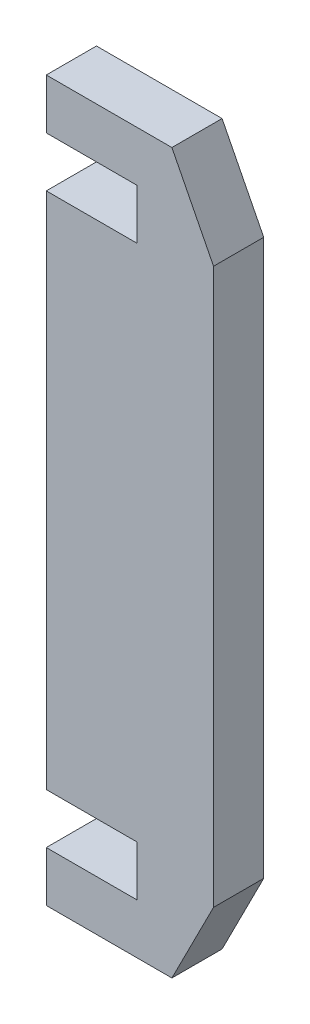
ISO-10303-21;
HEADER;
FILE_DESCRIPTION(('STEP AP214'),'2;1');
FILE_NAME('part.step','',(''),(''),'','','');
FILE_SCHEMA(('AUTOMOTIVE_DESIGN { 1 0 10303 214 1 1 1 1 }'));
ENDSEC;
DATA;
#1=APPLICATION_CONTEXT('core data for automotive mechanical design processes');
#2=APPLICATION_PROTOCOL_DEFINITION('international standard','automotive_design',2000,#1);
#3=PRODUCT_CONTEXT('',#1,'mechanical');
#4=PRODUCT('Part','Part','',(#3));
#5=PRODUCT_RELATED_PRODUCT_CATEGORY('part','',(#4));
#6=PRODUCT_DEFINITION_FORMATION('','',#4);
#7=PRODUCT_DEFINITION_CONTEXT('part definition',#1,'design');
#8=PRODUCT_DEFINITION('design','',#6,#7);
#9=PRODUCT_DEFINITION_SHAPE('','',#8);
#10=(LENGTH_UNIT() NAMED_UNIT(*) SI_UNIT(.MILLI.,.METRE.));
#11=(NAMED_UNIT(*) PLANE_ANGLE_UNIT() SI_UNIT($,.RADIAN.));
#12=(NAMED_UNIT(*) SI_UNIT($,.STERADIAN.) SOLID_ANGLE_UNIT());
#13=UNCERTAINTY_MEASURE_WITH_UNIT(LENGTH_MEASURE(1.E-05),#10,'distance_accuracy_value','');
#14=(GEOMETRIC_REPRESENTATION_CONTEXT(3) GLOBAL_UNCERTAINTY_ASSIGNED_CONTEXT((#13)) GLOBAL_UNIT_ASSIGNED_CONTEXT((#10,
#11,#12)) REPRESENTATION_CONTEXT('',''));
#15=CARTESIAN_POINT('',(0.,0.,0.));
#16=DIRECTION('',(0.,0.,1.));
#17=DIRECTION('',(1.,0.,0.));
#18=AXIS2_PLACEMENT_3D('',#15,#16,#17);
#19=CARTESIAN_POINT('',(872.909650659041,-119.420281102251,3.));
#20=DIRECTION('',(0.,1.,0.));
#21=DIRECTION('',(0.,0.,1.));
#22=AXIS2_PLACEMENT_3D('',#19,#20,#21);
#23=PLANE('',#22);
#24=DIRECTION('',(1.,0.,0.));
#25=VECTOR('',#24,1.);
#26=CARTESIAN_POINT('',(872.909650659041,-119.420281102251,0.));
#27=LINE('',#26,#25);
#28=CARTESIAN_POINT('',(872.909650659041,-119.420281102251,0.));
#29=VERTEX_POINT('',#28);
#30=CARTESIAN_POINT('',(880.419804328036,-119.420281102251,0.));
#31=VERTEX_POINT('',#30);
#32=EDGE_CURVE('E136',#29,#31,#27,.T.);
#33=ORIENTED_EDGE('',*,*,#32,.T.);
#34=DIRECTION('',(0.,0.,-1.));
#35=VECTOR('',#34,1.);
#36=CARTESIAN_POINT('',(880.419804328036,-119.420281102251,3.));
#37=LINE('',#36,#35);
#38=CARTESIAN_POINT('',(880.419804328036,-119.420281102251,3.));
#39=VERTEX_POINT('',#38);
#40=EDGE_CURVE('E11',#39,#31,#37,.T.);
#41=ORIENTED_EDGE('',*,*,#40,.F.);
#42=DIRECTION('',(1.,0.,0.));
#43=VECTOR('',#42,1.);
#44=CARTESIAN_POINT('',(872.909650659041,-119.420281102251,3.));
#45=LINE('',#44,#43);
#46=CARTESIAN_POINT('',(872.909650659041,-119.420281102251,3.));
#47=VERTEX_POINT('',#46);
#48=EDGE_CURVE('E176',#47,#39,#45,.T.);
#49=ORIENTED_EDGE('',*,*,#48,.F.);
#50=DIRECTION('',(0.,0.,-1.));
#51=VECTOR('',#50,1.);
#52=CARTESIAN_POINT('',(872.909650659041,-119.420281102251,3.));
#53=LINE('',#52,#51);
#54=EDGE_CURVE('E149',#47,#29,#53,.T.);
#55=ORIENTED_EDGE('',*,*,#54,.T.);
#56=EDGE_LOOP('',(#33,#41,#49,#55));
#57=FACE_BOUND('',#56,.T.);
#58=ADVANCED_FACE('F32',(#57),#23,.F.);
#59=CARTESIAN_POINT('',(880.419804328036,-119.420281102251,3.));
#60=DIRECTION('',(-0.891625628701499,0.452773385086465,0.));
#61=DIRECTION('',(-0.452773385086465,-0.891625628701499,0.));
#62=AXIS2_PLACEMENT_3D('',#59,#60,#61);
#63=PLANE('',#62);
#64=DIRECTION('',(0.452773385086465,0.891625628701499,0.));
#65=VECTOR('',#64,1.);
#66=CARTESIAN_POINT('',(880.419804328036,-119.420281102251,0.));
#67=LINE('',#66,#65);
#68=CARTESIAN_POINT('',(882.909650659041,-114.517142195734,0.));
#69=VERTEX_POINT('',#68);
#70=EDGE_CURVE('E132',#31,#69,#67,.T.);
#71=ORIENTED_EDGE('',*,*,#70,.T.);
#72=DIRECTION('',(0.,0.,-1.));
#73=VECTOR('',#72,1.);
#74=CARTESIAN_POINT('',(882.909650659041,-114.517142195734,3.));
#75=LINE('',#74,#73);
#76=CARTESIAN_POINT('',(882.909650659041,-114.517142195734,3.));
#77=VERTEX_POINT('',#76);
#78=EDGE_CURVE('E39',#77,#69,#75,.T.);
#79=ORIENTED_EDGE('',*,*,#78,.F.);
#80=DIRECTION('',(0.452773385086465,0.891625628701499,0.));
#81=VECTOR('',#80,1.);
#82=CARTESIAN_POINT('',(880.419804328036,-119.420281102251,3.));
#83=LINE('',#82,#81);
#84=EDGE_CURVE('E145',#39,#77,#83,.T.);
#85=ORIENTED_EDGE('',*,*,#84,.F.);
#86=ORIENTED_EDGE('',*,*,#40,.T.);
#87=EDGE_LOOP('',(#71,#79,#85,#86));
#88=FACE_BOUND('',#87,.T.);
#89=ADVANCED_FACE('F144',(#88),#63,.F.);
#90=CARTESIAN_POINT('',(882.909650659041,-114.517142195734,3.));
#91=DIRECTION('',(-1.,0.,0.));
#92=DIRECTION('',(0.,0.,1.));
#93=AXIS2_PLACEMENT_3D('',#90,#91,#92);
#94=PLANE('',#93);
#95=DIRECTION('',(0.,1.,0.));
#96=VECTOR('',#95,1.);
#97=CARTESIAN_POINT('',(882.909650659041,-114.517142195734,0.));
#98=LINE('',#97,#96);
#99=CARTESIAN_POINT('',(882.909650659041,-81.3234200087674,0.));
#100=VERTEX_POINT('',#99);
#101=EDGE_CURVE('E138',#69,#100,#98,.T.);
#102=ORIENTED_EDGE('',*,*,#101,.T.);
#103=DIRECTION('',(0.,0.,-1.));
#104=VECTOR('',#103,1.);
#105=CARTESIAN_POINT('',(882.909650659041,-81.3234200087674,3.));
#106=LINE('',#105,#104);
#107=CARTESIAN_POINT('',(882.909650659041,-81.3234200087674,3.));
#108=VERTEX_POINT('',#107);
#109=EDGE_CURVE('E232',#108,#100,#106,.T.);
#110=ORIENTED_EDGE('',*,*,#109,.F.);
#111=DIRECTION('',(0.,1.,0.));
#112=VECTOR('',#111,1.);
#113=CARTESIAN_POINT('',(882.909650659041,-114.517142195734,3.));
#114=LINE('',#113,#112);
#115=EDGE_CURVE('E179',#77,#108,#114,.T.);
#116=ORIENTED_EDGE('',*,*,#115,.F.);
#117=ORIENTED_EDGE('',*,*,#78,.T.);
#118=EDGE_LOOP('',(#102,#110,#116,#117));
#119=FACE_BOUND('',#118,.T.);
#120=ADVANCED_FACE('F236',(#119),#94,.F.);
#121=CARTESIAN_POINT('',(880.419804328036,-76.4202811022508,3.));
#122=DIRECTION('',(-0.891625628701499,-0.452773385086465,0.));
#123=DIRECTION('',(0.452773385086465,-0.891625628701499,0.));
#124=AXIS2_PLACEMENT_3D('',#121,#122,#123);
#125=PLANE('',#124);
#126=DIRECTION('',(-0.452773385086465,0.891625628701499,0.));
#127=VECTOR('',#126,1.);
#128=CARTESIAN_POINT('',(880.419804328036,-76.4202811022508,0.));
#129=LINE('',#128,#127);
#130=CARTESIAN_POINT('',(880.419804328036,-76.4202811022508,0.));
#131=VERTEX_POINT('',#130);
#132=EDGE_CURVE('E153',#100,#131,#129,.T.);
#133=ORIENTED_EDGE('',*,*,#132,.T.);
#134=DIRECTION('',(0.,0.,-1.));
#135=VECTOR('',#134,1.);
#136=CARTESIAN_POINT('',(880.419804328036,-76.4202811022508,3.));
#137=LINE('',#136,#135);
#138=CARTESIAN_POINT('',(880.419804328036,-76.4202811022508,3.));
#139=VERTEX_POINT('',#138);
#140=EDGE_CURVE('E229',#139,#131,#137,.T.);
#141=ORIENTED_EDGE('',*,*,#140,.F.);
#142=DIRECTION('',(-0.452773385086465,0.891625628701499,0.));
#143=VECTOR('',#142,1.);
#144=CARTESIAN_POINT('',(880.419804328036,-76.4202811022508,3.));
#145=LINE('',#144,#143);
#146=EDGE_CURVE('E181',#108,#139,#145,.T.);
#147=ORIENTED_EDGE('',*,*,#146,.F.);
#148=ORIENTED_EDGE('',*,*,#109,.T.);
#149=EDGE_LOOP('',(#133,#141,#147,#148));
#150=FACE_BOUND('',#149,.T.);
#151=ADVANCED_FACE('F244',(#150),#125,.F.);
#152=CARTESIAN_POINT('',(872.909650659041,-76.4202811022508,3.));
#153=DIRECTION('',(0.,-1.,0.));
#154=DIRECTION('',(0.,0.,-1.));
#155=AXIS2_PLACEMENT_3D('',#152,#153,#154);
#156=PLANE('',#155);
#157=DIRECTION('',(-1.,0.,0.));
#158=VECTOR('',#157,1.);
#159=CARTESIAN_POINT('',(872.909650659041,-76.4202811022508,0.));
#160=LINE('',#159,#158);
#161=CARTESIAN_POINT('',(872.909650659041,-76.4202811022508,0.));
#162=VERTEX_POINT('',#161);
#163=EDGE_CURVE('E155',#131,#162,#160,.T.);
#164=ORIENTED_EDGE('',*,*,#163,.T.);
#165=DIRECTION('',(0.,0.,-1.));
#166=VECTOR('',#165,1.);
#167=CARTESIAN_POINT('',(872.909650659041,-76.4202811022508,3.));
#168=LINE('',#167,#166);
#169=CARTESIAN_POINT('',(872.909650659041,-76.4202811022508,3.));
#170=VERTEX_POINT('',#169);
#171=EDGE_CURVE('E226',#170,#162,#168,.T.);
#172=ORIENTED_EDGE('',*,*,#171,.F.);
#173=DIRECTION('',(-1.,0.,0.));
#174=VECTOR('',#173,1.);
#175=CARTESIAN_POINT('',(872.909650659041,-76.4202811022508,3.));
#176=LINE('',#175,#174);
#177=EDGE_CURVE('E183',#139,#170,#176,.T.);
#178=ORIENTED_EDGE('',*,*,#177,.F.);
#179=ORIENTED_EDGE('',*,*,#140,.T.);
#180=EDGE_LOOP('',(#164,#172,#178,#179));
#181=FACE_BOUND('',#180,.T.);
#182=ADVANCED_FACE('F247',(#181),#156,.F.);
#183=CARTESIAN_POINT('',(872.909650659041,-79.4202811022508,3.));
#184=DIRECTION('',(1.,0.,0.));
#185=DIRECTION('',(0.,0.,-1.));
#186=AXIS2_PLACEMENT_3D('',#183,#184,#185);
#187=PLANE('',#186);
#188=DIRECTION('',(0.,-1.,0.));
#189=VECTOR('',#188,1.);
#190=CARTESIAN_POINT('',(872.909650659041,-79.4202811022508,0.));
#191=LINE('',#190,#189);
#192=CARTESIAN_POINT('',(872.909650659041,-79.4202811022508,0.));
#193=VERTEX_POINT('',#192);
#194=EDGE_CURVE('E157',#162,#193,#191,.T.);
#195=ORIENTED_EDGE('',*,*,#194,.T.);
#196=DIRECTION('',(0.,0.,-1.));
#197=VECTOR('',#196,1.);
#198=CARTESIAN_POINT('',(872.909650659041,-79.4202811022508,3.));
#199=LINE('',#198,#197);
#200=CARTESIAN_POINT('',(872.909650659041,-79.4202811022508,3.));
#201=VERTEX_POINT('',#200);
#202=EDGE_CURVE('E223',#201,#193,#199,.T.);
#203=ORIENTED_EDGE('',*,*,#202,.F.);
#204=DIRECTION('',(0.,-1.,0.));
#205=VECTOR('',#204,1.);
#206=CARTESIAN_POINT('',(872.909650659041,-79.4202811022508,3.));
#207=LINE('',#206,#205);
#208=EDGE_CURVE('E185',#170,#201,#207,.T.);
#209=ORIENTED_EDGE('',*,*,#208,.F.);
#210=ORIENTED_EDGE('',*,*,#171,.T.);
#211=EDGE_LOOP('',(#195,#203,#209,#210));
#212=FACE_BOUND('',#211,.T.);
#213=ADVANCED_FACE('F252',(#212),#187,.F.);
#214=CARTESIAN_POINT('',(878.318576624196,-79.4202811022508,3.));
#215=DIRECTION('',(0.,1.,0.));
#216=DIRECTION('',(0.,0.,1.));
#217=AXIS2_PLACEMENT_3D('',#214,#215,#216);
#218=PLANE('',#217);
#219=DIRECTION('',(1.,0.,0.));
#220=VECTOR('',#219,1.);
#221=CARTESIAN_POINT('',(878.318576624196,-79.4202811022508,0.));
#222=LINE('',#221,#220);
#223=CARTESIAN_POINT('',(878.318576624196,-79.4202811022508,0.));
#224=VERTEX_POINT('',#223);
#225=EDGE_CURVE('E159',#193,#224,#222,.T.);
#226=ORIENTED_EDGE('',*,*,#225,.T.);
#227=DIRECTION('',(0.,0.,-1.));
#228=VECTOR('',#227,1.);
#229=CARTESIAN_POINT('',(878.318576624196,-79.4202811022508,3.));
#230=LINE('',#229,#228);
#231=CARTESIAN_POINT('',(878.318576624196,-79.4202811022508,3.));
#232=VERTEX_POINT('',#231);
#233=EDGE_CURVE('E220',#232,#224,#230,.T.);
#234=ORIENTED_EDGE('',*,*,#233,.F.);
#235=DIRECTION('',(1.,0.,0.));
#236=VECTOR('',#235,1.);
#237=CARTESIAN_POINT('',(878.318576624196,-79.4202811022508,3.));
#238=LINE('',#237,#236);
#239=EDGE_CURVE('E187',#201,#232,#238,.T.);
#240=ORIENTED_EDGE('',*,*,#239,.F.);
#241=ORIENTED_EDGE('',*,*,#202,.T.);
#242=EDGE_LOOP('',(#226,#234,#240,#241));
#243=FACE_BOUND('',#242,.T.);
#244=ADVANCED_FACE('F258',(#243),#218,.F.);
#245=CARTESIAN_POINT('',(878.318576624196,-79.4202811022508,3.));
#246=DIRECTION('',(1.,0.,0.));
#247=DIRECTION('',(0.,0.,-1.));
#248=AXIS2_PLACEMENT_3D('',#245,#246,#247);
#249=PLANE('',#248);
#250=DIRECTION('',(0.,-1.,0.));
#251=VECTOR('',#250,1.);
#252=CARTESIAN_POINT('',(878.318576624196,-79.4202811022508,0.));
#253=LINE('',#252,#251);
#254=CARTESIAN_POINT('',(878.318576624196,-82.4202811022508,0.));
#255=VERTEX_POINT('',#254);
#256=EDGE_CURVE('E161',#224,#255,#253,.T.);
#257=ORIENTED_EDGE('',*,*,#256,.T.);
#258=DIRECTION('',(0.,0.,-1.));
#259=VECTOR('',#258,1.);
#260=CARTESIAN_POINT('',(878.318576624196,-82.4202811022508,3.));
#261=LINE('',#260,#259);
#262=CARTESIAN_POINT('',(878.318576624196,-82.4202811022508,3.));
#263=VERTEX_POINT('',#262);
#264=EDGE_CURVE('E217',#263,#255,#261,.T.);
#265=ORIENTED_EDGE('',*,*,#264,.F.);
#266=DIRECTION('',(0.,-1.,0.));
#267=VECTOR('',#266,1.);
#268=CARTESIAN_POINT('',(878.318576624196,-79.4202811022508,3.));
#269=LINE('',#268,#267);
#270=EDGE_CURVE('E189',#232,#263,#269,.T.);
#271=ORIENTED_EDGE('',*,*,#270,.F.);
#272=ORIENTED_EDGE('',*,*,#233,.T.);
#273=EDGE_LOOP('',(#257,#265,#271,#272));
#274=FACE_BOUND('',#273,.T.);
#275=ADVANCED_FACE('F262',(#274),#249,.F.);
#276=CARTESIAN_POINT('',(872.909650659041,-82.4202811022508,3.));
#277=DIRECTION('',(0.,-1.,0.));
#278=DIRECTION('',(1.,0.,0.));
#279=AXIS2_PLACEMENT_3D('',#276,#277,#278);
#280=PLANE('',#279);
#281=DIRECTION('',(-1.,0.,0.));
#282=VECTOR('',#281,1.);
#283=CARTESIAN_POINT('',(872.909650659041,-82.4202811022508,0.));
#284=LINE('',#283,#282);
#285=CARTESIAN_POINT('',(872.909650659041,-82.4202811022508,0.));
#286=VERTEX_POINT('',#285);
#287=EDGE_CURVE('E163',#255,#286,#284,.T.);
#288=ORIENTED_EDGE('',*,*,#287,.T.);
#289=DIRECTION('',(0.,0.,-1.));
#290=VECTOR('',#289,1.);
#291=CARTESIAN_POINT('',(872.909650659041,-82.4202811022508,3.));
#292=LINE('',#291,#290);
#293=CARTESIAN_POINT('',(872.909650659041,-82.4202811022508,3.));
#294=VERTEX_POINT('',#293);
#295=EDGE_CURVE('E214',#294,#286,#292,.T.);
#296=ORIENTED_EDGE('',*,*,#295,.F.);
#297=DIRECTION('',(-1.,0.,0.));
#298=VECTOR('',#297,1.);
#299=CARTESIAN_POINT('',(872.909650659041,-82.4202811022508,3.));
#300=LINE('',#299,#298);
#301=EDGE_CURVE('E191',#263,#294,#300,.T.);
#302=ORIENTED_EDGE('',*,*,#301,.F.);
#303=ORIENTED_EDGE('',*,*,#264,.T.);
#304=EDGE_LOOP('',(#288,#296,#302,#303));
#305=FACE_BOUND('',#304,.T.);
#306=ADVANCED_FACE('F267',(#305),#280,.F.);
#307=CARTESIAN_POINT('',(872.909650659041,-113.420281102251,3.));
#308=DIRECTION('',(1.,0.,0.));
#309=DIRECTION('',(0.,0.,-1.));
#310=AXIS2_PLACEMENT_3D('',#307,#308,#309);
#311=PLANE('',#310);
#312=DIRECTION('',(0.,-1.,0.));
#313=VECTOR('',#312,1.);
#314=CARTESIAN_POINT('',(872.909650659041,-113.420281102251,0.));
#315=LINE('',#314,#313);
#316=CARTESIAN_POINT('',(872.909650659041,-113.420281102251,0.));
#317=VERTEX_POINT('',#316);
#318=EDGE_CURVE('E166',#286,#317,#315,.T.);
#319=ORIENTED_EDGE('',*,*,#318,.T.);
#320=DIRECTION('',(0.,0.,-1.));
#321=VECTOR('',#320,1.);
#322=CARTESIAN_POINT('',(872.909650659041,-113.420281102251,3.));
#323=LINE('',#322,#321);
#324=CARTESIAN_POINT('',(872.909650659041,-113.420281102251,3.));
#325=VERTEX_POINT('',#324);
#326=EDGE_CURVE('E211',#325,#317,#323,.T.);
#327=ORIENTED_EDGE('',*,*,#326,.F.);
#328=DIRECTION('',(0.,-1.,0.));
#329=VECTOR('',#328,1.);
#330=CARTESIAN_POINT('',(872.909650659041,-82.4202811022508,3.));
#331=LINE('',#330,#329);
#332=EDGE_CURVE('E193',#294,#325,#331,.T.);
#333=ORIENTED_EDGE('',*,*,#332,.F.);
#334=ORIENTED_EDGE('',*,*,#295,.T.);
#335=EDGE_LOOP('',(#319,#327,#333,#334));
#336=FACE_BOUND('',#335,.T.);
#337=ADVANCED_FACE('F273',(#336),#311,.F.);
#338=CARTESIAN_POINT('',(872.909650659041,-113.420281102251,3.));
#339=DIRECTION('',(0.,1.,0.));
#340=DIRECTION('',(-1.,0.,0.));
#341=AXIS2_PLACEMENT_3D('',#338,#339,#340);
#342=PLANE('',#341);
#343=DIRECTION('',(1.,0.,0.));
#344=VECTOR('',#343,1.);
#345=CARTESIAN_POINT('',(872.909650659041,-113.420281102251,0.));
#346=LINE('',#345,#344);
#347=CARTESIAN_POINT('',(878.318576624196,-113.420281102251,0.));
#348=VERTEX_POINT('',#347);
#349=EDGE_CURVE('E168',#317,#348,#346,.T.);
#350=ORIENTED_EDGE('',*,*,#349,.T.);
#351=DIRECTION('',(0.,0.,-1.));
#352=VECTOR('',#351,1.);
#353=CARTESIAN_POINT('',(878.318576624196,-113.420281102251,3.));
#354=LINE('',#353,#352);
#355=CARTESIAN_POINT('',(878.318576624196,-113.420281102251,3.));
#356=VERTEX_POINT('',#355);
#357=EDGE_CURVE('E208',#356,#348,#354,.T.);
#358=ORIENTED_EDGE('',*,*,#357,.F.);
#359=DIRECTION('',(1.,0.,0.));
#360=VECTOR('',#359,1.);
#361=CARTESIAN_POINT('',(872.909650659041,-113.420281102251,3.));
#362=LINE('',#361,#360);
#363=EDGE_CURVE('E195',#325,#356,#362,.T.);
#364=ORIENTED_EDGE('',*,*,#363,.F.);
#365=ORIENTED_EDGE('',*,*,#326,.T.);
#366=EDGE_LOOP('',(#350,#358,#364,#365));
#367=FACE_BOUND('',#366,.T.);
#368=ADVANCED_FACE('F276',(#367),#342,.F.);
#369=CARTESIAN_POINT('',(878.318576624196,-113.420281102251,3.));
#370=DIRECTION('',(1.,0.,0.));
#371=DIRECTION('',(0.,0.,-1.));
#372=AXIS2_PLACEMENT_3D('',#369,#370,#371);
#373=PLANE('',#372);
#374=DIRECTION('',(0.,-1.,0.));
#375=VECTOR('',#374,1.);
#376=CARTESIAN_POINT('',(878.318576624196,-113.420281102251,0.));
#377=LINE('',#376,#375);
#378=CARTESIAN_POINT('',(878.318576624196,-116.420281102251,0.));
#379=VERTEX_POINT('',#378);
#380=EDGE_CURVE('E170',#348,#379,#377,.T.);
#381=ORIENTED_EDGE('',*,*,#380,.T.);
#382=DIRECTION('',(0.,0.,-1.));
#383=VECTOR('',#382,1.);
#384=CARTESIAN_POINT('',(878.318576624196,-116.420281102251,3.));
#385=LINE('',#384,#383);
#386=CARTESIAN_POINT('',(878.318576624196,-116.420281102251,3.));
#387=VERTEX_POINT('',#386);
#388=EDGE_CURVE('E205',#387,#379,#385,.T.);
#389=ORIENTED_EDGE('',*,*,#388,.F.);
#390=DIRECTION('',(0.,-1.,0.));
#391=VECTOR('',#390,1.);
#392=CARTESIAN_POINT('',(878.318576624196,-113.420281102251,3.));
#393=LINE('',#392,#391);
#394=EDGE_CURVE('E197',#356,#387,#393,.T.);
#395=ORIENTED_EDGE('',*,*,#394,.F.);
#396=ORIENTED_EDGE('',*,*,#357,.T.);
#397=EDGE_LOOP('',(#381,#389,#395,#396));
#398=FACE_BOUND('',#397,.T.);
#399=ADVANCED_FACE('F281',(#398),#373,.F.);
#400=CARTESIAN_POINT('',(878.318576624196,-116.420281102251,3.));
#401=DIRECTION('',(0.,-1.,0.));
#402=DIRECTION('',(0.,0.,-1.));
#403=AXIS2_PLACEMENT_3D('',#400,#401,#402);
#404=PLANE('',#403);
#405=DIRECTION('',(-1.,0.,0.));
#406=VECTOR('',#405,1.);
#407=CARTESIAN_POINT('',(878.318576624196,-116.420281102251,0.));
#408=LINE('',#407,#406);
#409=CARTESIAN_POINT('',(872.909650659041,-116.420281102251,0.));
#410=VERTEX_POINT('',#409);
#411=EDGE_CURVE('E172',#379,#410,#408,.T.);
#412=ORIENTED_EDGE('',*,*,#411,.T.);
#413=DIRECTION('',(0.,0.,-1.));
#414=VECTOR('',#413,1.);
#415=CARTESIAN_POINT('',(872.909650659041,-116.420281102251,3.));
#416=LINE('',#415,#414);
#417=CARTESIAN_POINT('',(872.909650659041,-116.420281102251,3.));
#418=VERTEX_POINT('',#417);
#419=EDGE_CURVE('E202',#418,#410,#416,.T.);
#420=ORIENTED_EDGE('',*,*,#419,.F.);
#421=DIRECTION('',(-1.,0.,0.));
#422=VECTOR('',#421,1.);
#423=CARTESIAN_POINT('',(878.318576624196,-116.420281102251,3.));
#424=LINE('',#423,#422);
#425=EDGE_CURVE('E51',#387,#418,#424,.T.);
#426=ORIENTED_EDGE('',*,*,#425,.F.);
#427=ORIENTED_EDGE('',*,*,#388,.T.);
#428=EDGE_LOOP('',(#412,#420,#426,#427));
#429=FACE_BOUND('',#428,.T.);
#430=ADVANCED_FACE('F284',(#429),#404,.F.);
#431=CARTESIAN_POINT('',(872.909650659041,-119.420281102251,3.));
#432=DIRECTION('',(1.,0.,0.));
#433=DIRECTION('',(0.,0.,-1.));
#434=AXIS2_PLACEMENT_3D('',#431,#432,#433);
#435=PLANE('',#434);
#436=DIRECTION('',(0.,-1.,0.));
#437=VECTOR('',#436,1.);
#438=CARTESIAN_POINT('',(872.909650659041,-119.420281102251,0.));
#439=LINE('',#438,#437);
#440=EDGE_CURVE('E174',#410,#29,#439,.T.);
#441=ORIENTED_EDGE('',*,*,#440,.T.);
#442=ORIENTED_EDGE('',*,*,#54,.F.);
#443=DIRECTION('',(0.,-1.,0.));
#444=VECTOR('',#443,1.);
#445=CARTESIAN_POINT('',(872.909650659041,-119.420281102251,3.));
#446=LINE('',#445,#444);
#447=EDGE_CURVE('E46',#418,#47,#446,.T.);
#448=ORIENTED_EDGE('',*,*,#447,.F.);
#449=ORIENTED_EDGE('',*,*,#419,.T.);
#450=EDGE_LOOP('',(#441,#442,#448,#449));
#451=FACE_BOUND('',#450,.T.);
#452=ADVANCED_FACE('F286',(#451),#435,.F.);
#453=CARTESIAN_POINT('',(882.909650659041,-119.420281102251,3.));
#454=DIRECTION('',(0.,0.,1.));
#455=DIRECTION('',(1.,0.,0.));
#456=AXIS2_PLACEMENT_3D('',#453,#454,#455);
#457=PLANE('',#456);
#458=ORIENTED_EDGE('',*,*,#48,.T.);
#459=ORIENTED_EDGE('',*,*,#84,.T.);
#460=ORIENTED_EDGE('',*,*,#115,.T.);
#461=ORIENTED_EDGE('',*,*,#146,.T.);
#462=ORIENTED_EDGE('',*,*,#177,.T.);
#463=ORIENTED_EDGE('',*,*,#208,.T.);
#464=ORIENTED_EDGE('',*,*,#239,.T.);
#465=ORIENTED_EDGE('',*,*,#270,.T.);
#466=ORIENTED_EDGE('',*,*,#301,.T.);
#467=ORIENTED_EDGE('',*,*,#332,.T.);
#468=ORIENTED_EDGE('',*,*,#363,.T.);
#469=ORIENTED_EDGE('',*,*,#394,.T.);
#470=ORIENTED_EDGE('',*,*,#425,.T.);
#471=ORIENTED_EDGE('',*,*,#447,.T.);
#472=EDGE_LOOP('',(#458,#459,#460,#461,#462,#463,#464,#465,#466,#467,#468,#469,#470,#471));
#473=FACE_BOUND('',#472,.T.);
#474=ADVANCED_FACE('F239',(#473),#457,.T.);
#475=CARTESIAN_POINT('',(882.909650659041,-119.420281102251,0.));
#476=DIRECTION('',(0.,0.,1.));
#477=DIRECTION('',(1.,0.,0.));
#478=AXIS2_PLACEMENT_3D('',#475,#476,#477);
#479=PLANE('',#478);
#480=ORIENTED_EDGE('',*,*,#32,.F.);
#481=ORIENTED_EDGE('',*,*,#440,.F.);
#482=ORIENTED_EDGE('',*,*,#411,.F.);
#483=ORIENTED_EDGE('',*,*,#380,.F.);
#484=ORIENTED_EDGE('',*,*,#349,.F.);
#485=ORIENTED_EDGE('',*,*,#318,.F.);
#486=ORIENTED_EDGE('',*,*,#287,.F.);
#487=ORIENTED_EDGE('',*,*,#256,.F.);
#488=ORIENTED_EDGE('',*,*,#225,.F.);
#489=ORIENTED_EDGE('',*,*,#194,.F.);
#490=ORIENTED_EDGE('',*,*,#163,.F.);
#491=ORIENTED_EDGE('',*,*,#132,.F.);
#492=ORIENTED_EDGE('',*,*,#101,.F.);
#493=ORIENTED_EDGE('',*,*,#70,.F.);
#494=EDGE_LOOP('',(#480,#481,#482,#483,#484,#485,#486,#487,#488,#489,#490,#491,#492,#493));
#495=FACE_BOUND('',#494,.T.);
#496=ADVANCED_FACE('F133',(#495),#479,.F.);
#497=CLOSED_SHELL('',(#58,#89,#120,#151,#182,#213,#244,#275,#306,#337,#368,#399,#430,#452,#474,#496));
#498=MANIFOLD_SOLID_BREP('B2',#497);
#499=ADVANCED_BREP_SHAPE_REPRESENTATION('',(#18,#498),#14);
#500=SHAPE_DEFINITION_REPRESENTATION(#9,#499);
ENDSEC;
END-ISO-10303-21;
